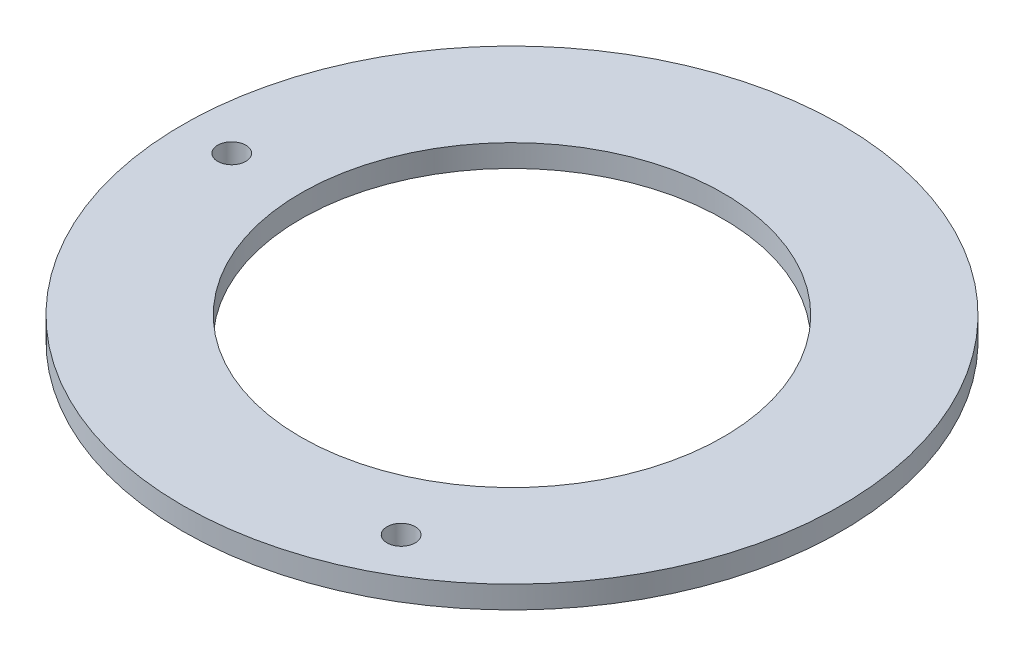
ISO-10303-21;
HEADER;
FILE_DESCRIPTION(('STEP AP214'),'2;1');
FILE_NAME('part.step','',(''),(''),'','','');
FILE_SCHEMA(('AUTOMOTIVE_DESIGN { 1 0 10303 214 1 1 1 1 }'));
ENDSEC;
DATA;
#1=APPLICATION_CONTEXT('core data for automotive mechanical design processes');
#2=APPLICATION_PROTOCOL_DEFINITION('international standard','automotive_design',2000,#1);
#3=PRODUCT_CONTEXT('',#1,'mechanical');
#4=PRODUCT('Part','Part','',(#3));
#5=PRODUCT_RELATED_PRODUCT_CATEGORY('part','',(#4));
#6=PRODUCT_DEFINITION_FORMATION('','',#4);
#7=PRODUCT_DEFINITION_CONTEXT('part definition',#1,'design');
#8=PRODUCT_DEFINITION('design','',#6,#7);
#9=PRODUCT_DEFINITION_SHAPE('','',#8);
#10=(LENGTH_UNIT() NAMED_UNIT(*) SI_UNIT(.MILLI.,.METRE.));
#11=(NAMED_UNIT(*) PLANE_ANGLE_UNIT() SI_UNIT($,.RADIAN.));
#12=(NAMED_UNIT(*) SI_UNIT($,.STERADIAN.) SOLID_ANGLE_UNIT());
#13=UNCERTAINTY_MEASURE_WITH_UNIT(LENGTH_MEASURE(1.E-05),#10,'distance_accuracy_value','');
#14=(GEOMETRIC_REPRESENTATION_CONTEXT(3) GLOBAL_UNCERTAINTY_ASSIGNED_CONTEXT((#13)) GLOBAL_UNIT_ASSIGNED_CONTEXT((#10,
#11,#12)) REPRESENTATION_CONTEXT('',''));
#15=CARTESIAN_POINT('',(0.,0.,0.));
#16=DIRECTION('',(0.,0.,1.));
#17=DIRECTION('',(1.,0.,0.));
#18=AXIS2_PLACEMENT_3D('',#15,#16,#17);
#19=CARTESIAN_POINT('',(0.,3.175,0.));
#20=DIRECTION('',(0.,1.,0.));
#21=DIRECTION('',(0.,0.,1.));
#22=AXIS2_PLACEMENT_3D('',#19,#20,#21);
#23=PLANE('',#22);
#24=CARTESIAN_POINT('',(-39.8,3.175,0.));
#25=DIRECTION('',(0.,1.,0.));
#26=DIRECTION('',(0.,0.,1.));
#27=AXIS2_PLACEMENT_3D('',#24,#25,#26);
#28=CIRCLE('',#27,2.);
#29=CARTESIAN_POINT('',(-39.8,3.175,2.));
#30=VERTEX_POINT('',#29);
#31=EDGE_CURVE('E47',#30,#30,#28,.T.);
#32=ORIENTED_EDGE('',*,*,#31,.F.);
#33=EDGE_LOOP('',(#32));
#34=FACE_BOUND('',#33,.T.);
#35=CARTESIAN_POINT('',(0.,3.175,0.));
#36=DIRECTION('',(0.,1.,0.));
#37=DIRECTION('',(0.,0.,1.));
#38=AXIS2_PLACEMENT_3D('',#35,#36,#37);
#39=CIRCLE('',#38,46.8);
#40=CARTESIAN_POINT('',(0.,3.175,46.8));
#41=VERTEX_POINT('',#40);
#42=EDGE_CURVE('E10',#41,#41,#39,.T.);
#43=ORIENTED_EDGE('',*,*,#42,.T.);
#44=EDGE_LOOP('',(#43));
#45=FACE_BOUND('',#44,.T.);
#46=CARTESIAN_POINT('',(0.,3.175,0.));
#47=DIRECTION('',(0.,1.,0.));
#48=DIRECTION('',(0.,0.,1.));
#49=AXIS2_PLACEMENT_3D('',#46,#47,#48);
#50=CIRCLE('',#49,30.);
#51=CARTESIAN_POINT('',(0.,3.175,30.));
#52=VERTEX_POINT('',#51);
#53=EDGE_CURVE('E42',#52,#52,#50,.T.);
#54=ORIENTED_EDGE('',*,*,#53,.F.);
#55=EDGE_LOOP('',(#54));
#56=FACE_BOUND('',#55,.T.);
#57=CARTESIAN_POINT('',(19.1478643216081,3.175,34.8912495035831));
#58=DIRECTION('',(0.,1.,0.));
#59=DIRECTION('',(0.,0.,1.));
#60=AXIS2_PLACEMENT_3D('',#57,#58,#59);
#61=CIRCLE('',#60,2.);
#62=CARTESIAN_POINT('',(19.1478643216081,3.175,36.8912495035831));
#63=VERTEX_POINT('',#62);
#64=EDGE_CURVE('E53',#63,#63,#61,.T.);
#65=ORIENTED_EDGE('',*,*,#64,.F.);
#66=EDGE_LOOP('',(#65));
#67=FACE_BOUND('',#66,.T.);
#68=ADVANCED_FACE('F31',(#34,#45,#56,#67),#23,.T.);
#69=CARTESIAN_POINT('',(0.,0.,0.));
#70=DIRECTION('',(0.,1.,0.));
#71=DIRECTION('',(0.,0.,1.));
#72=AXIS2_PLACEMENT_3D('',#69,#70,#71);
#73=PLANE('',#72);
#74=CARTESIAN_POINT('',(-39.8,0.,0.));
#75=DIRECTION('',(0.,1.,0.));
#76=DIRECTION('',(0.,0.,1.));
#77=AXIS2_PLACEMENT_3D('',#74,#75,#76);
#78=CIRCLE('',#77,2.);
#79=CARTESIAN_POINT('',(-39.8,0.,2.));
#80=VERTEX_POINT('',#79);
#81=EDGE_CURVE('E50',#80,#80,#78,.T.);
#82=ORIENTED_EDGE('',*,*,#81,.T.);
#83=EDGE_LOOP('',(#82));
#84=FACE_BOUND('',#83,.T.);
#85=CARTESIAN_POINT('',(0.,0.,0.));
#86=DIRECTION('',(0.,1.,0.));
#87=DIRECTION('',(0.,0.,1.));
#88=AXIS2_PLACEMENT_3D('',#85,#86,#87);
#89=CIRCLE('',#88,46.8);
#90=CARTESIAN_POINT('',(0.,0.,46.8));
#91=VERTEX_POINT('',#90);
#92=EDGE_CURVE('E35',#91,#91,#89,.T.);
#93=ORIENTED_EDGE('',*,*,#92,.F.);
#94=EDGE_LOOP('',(#93));
#95=FACE_BOUND('',#94,.T.);
#96=CARTESIAN_POINT('',(0.,0.,0.));
#97=DIRECTION('',(0.,1.,0.));
#98=DIRECTION('',(0.,0.,1.));
#99=AXIS2_PLACEMENT_3D('',#96,#97,#98);
#100=CIRCLE('',#99,30.);
#101=CARTESIAN_POINT('',(0.,0.,30.));
#102=VERTEX_POINT('',#101);
#103=EDGE_CURVE('E44',#102,#102,#100,.T.);
#104=ORIENTED_EDGE('',*,*,#103,.T.);
#105=EDGE_LOOP('',(#104));
#106=FACE_BOUND('',#105,.T.);
#107=CARTESIAN_POINT('',(19.1478643216081,0.,34.8912495035831));
#108=DIRECTION('',(0.,1.,0.));
#109=DIRECTION('',(0.,0.,1.));
#110=AXIS2_PLACEMENT_3D('',#107,#108,#109);
#111=CIRCLE('',#110,2.);
#112=CARTESIAN_POINT('',(19.1478643216081,0.,36.8912495035831));
#113=VERTEX_POINT('',#112);
#114=EDGE_CURVE('E56',#113,#113,#111,.T.);
#115=ORIENTED_EDGE('',*,*,#114,.T.);
#116=EDGE_LOOP('',(#115));
#117=FACE_BOUND('',#116,.T.);
#118=ADVANCED_FACE('F66',(#84,#95,#106,#117),#73,.F.);
#119=CARTESIAN_POINT('',(0.,3.175,0.));
#120=DIRECTION('',(0.,-1.,0.));
#121=DIRECTION('',(0.,0.,-1.));
#122=AXIS2_PLACEMENT_3D('',#119,#120,#121);
#123=CYLINDRICAL_SURFACE('',#122,46.8);
#124=ORIENTED_EDGE('',*,*,#42,.F.);
#125=EDGE_LOOP('',(#124));
#126=FACE_BOUND('',#125,.T.);
#127=ORIENTED_EDGE('',*,*,#92,.T.);
#128=EDGE_LOOP('',(#127));
#129=FACE_BOUND('',#128,.T.);
#130=ADVANCED_FACE('F33',(#126,#129),#123,.T.);
#131=CARTESIAN_POINT('',(0.,3.175,0.));
#132=DIRECTION('',(0.,-1.,0.));
#133=DIRECTION('',(0.,0.,-1.));
#134=AXIS2_PLACEMENT_3D('',#131,#132,#133);
#135=CYLINDRICAL_SURFACE('',#134,30.);
#136=ORIENTED_EDGE('',*,*,#53,.T.);
#137=EDGE_LOOP('',(#136));
#138=FACE_BOUND('',#137,.T.);
#139=ORIENTED_EDGE('',*,*,#103,.F.);
#140=EDGE_LOOP('',(#139));
#141=FACE_BOUND('',#140,.T.);
#142=ADVANCED_FACE('F75',(#138,#141),#135,.F.);
#143=CARTESIAN_POINT('',(-39.8,3.175,0.));
#144=DIRECTION('',(0.,-1.,0.));
#145=DIRECTION('',(0.,0.,-1.));
#146=AXIS2_PLACEMENT_3D('',#143,#144,#145);
#147=CYLINDRICAL_SURFACE('',#146,2.);
#148=ORIENTED_EDGE('',*,*,#31,.T.);
#149=EDGE_LOOP('',(#148));
#150=FACE_BOUND('',#149,.T.);
#151=ORIENTED_EDGE('',*,*,#81,.F.);
#152=EDGE_LOOP('',(#151));
#153=FACE_BOUND('',#152,.T.);
#154=ADVANCED_FACE('F78',(#150,#153),#147,.F.);
#155=CARTESIAN_POINT('',(19.1478643216081,3.175,34.8912495035831));
#156=DIRECTION('',(0.,-1.,0.));
#157=DIRECTION('',(0.,0.,-1.));
#158=AXIS2_PLACEMENT_3D('',#155,#156,#157);
#159=CYLINDRICAL_SURFACE('',#158,2.);
#160=ORIENTED_EDGE('',*,*,#64,.T.);
#161=EDGE_LOOP('',(#160));
#162=FACE_BOUND('',#161,.T.);
#163=ORIENTED_EDGE('',*,*,#114,.F.);
#164=EDGE_LOOP('',(#163));
#165=FACE_BOUND('',#164,.T.);
#166=ADVANCED_FACE('F62',(#162,#165),#159,.F.);
#167=CLOSED_SHELL('',(#68,#118,#130,#142,#154,#166));
#168=MANIFOLD_SOLID_BREP('B2',#167);
#169=ADVANCED_BREP_SHAPE_REPRESENTATION('',(#18,#168),#14);
#170=SHAPE_DEFINITION_REPRESENTATION(#9,#169);
ENDSEC;
END-ISO-10303-21;
